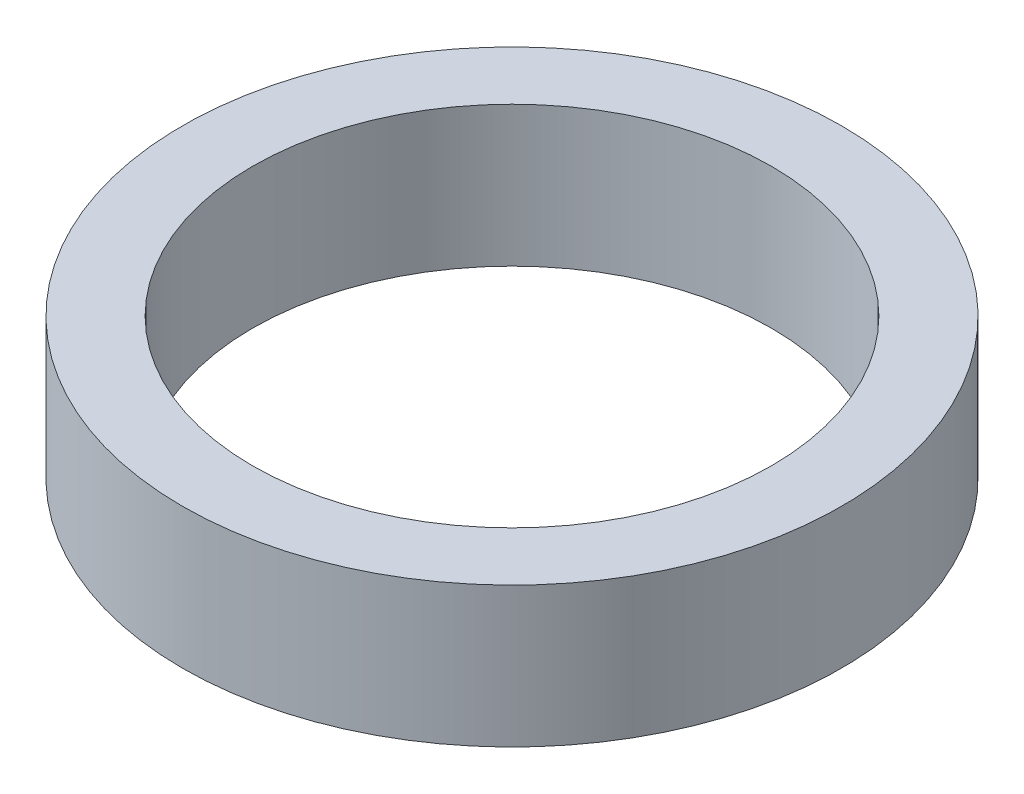
ISO-10303-21;
HEADER;
FILE_DESCRIPTION(('STEP AP214'),'2;1');
FILE_NAME('part.step','',(''),(''),'','','');
FILE_SCHEMA(('AUTOMOTIVE_DESIGN { 1 0 10303 214 1 1 1 1 }'));
ENDSEC;
DATA;
#1=APPLICATION_CONTEXT('core data for automotive mechanical design processes');
#2=APPLICATION_PROTOCOL_DEFINITION('international standard','automotive_design',2000,#1);
#3=PRODUCT_CONTEXT('',#1,'mechanical');
#4=PRODUCT('Part','Part','',(#3));
#5=PRODUCT_RELATED_PRODUCT_CATEGORY('part','',(#4));
#6=PRODUCT_DEFINITION_FORMATION('','',#4);
#7=PRODUCT_DEFINITION_CONTEXT('part definition',#1,'design');
#8=PRODUCT_DEFINITION('design','',#6,#7);
#9=PRODUCT_DEFINITION_SHAPE('','',#8);
#10=(LENGTH_UNIT() NAMED_UNIT(*) SI_UNIT(.MILLI.,.METRE.));
#11=(NAMED_UNIT(*) PLANE_ANGLE_UNIT() SI_UNIT($,.RADIAN.));
#12=(NAMED_UNIT(*) SI_UNIT($,.STERADIAN.) SOLID_ANGLE_UNIT());
#13=UNCERTAINTY_MEASURE_WITH_UNIT(LENGTH_MEASURE(1.E-05),#10,'distance_accuracy_value','');
#14=(GEOMETRIC_REPRESENTATION_CONTEXT(3) GLOBAL_UNCERTAINTY_ASSIGNED_CONTEXT((#13)) GLOBAL_UNIT_ASSIGNED_CONTEXT((#10,
#11,#12)) REPRESENTATION_CONTEXT('',''));
#15=CARTESIAN_POINT('',(0.,0.,0.));
#16=DIRECTION('',(0.,0.,1.));
#17=DIRECTION('',(1.,0.,0.));
#18=AXIS2_PLACEMENT_3D('',#15,#16,#17);
#19=CARTESIAN_POINT('',(0.,12.7,0.));
#20=DIRECTION('',(0.,-1.,0.));
#21=DIRECTION('',(0.,0.,-1.));
#22=AXIS2_PLACEMENT_3D('',#19,#20,#21);
#23=CYLINDRICAL_SURFACE('',#22,23.495);
#24=CARTESIAN_POINT('',(0.,12.7,0.));
#25=DIRECTION('',(0.,1.,0.));
#26=DIRECTION('',(0.,0.,1.));
#27=AXIS2_PLACEMENT_3D('',#24,#25,#26);
#28=CIRCLE('',#27,23.495);
#29=CARTESIAN_POINT('',(0.,12.7,23.495));
#30=VERTEX_POINT('',#29);
#31=EDGE_CURVE('E50',#30,#30,#28,.T.);
#32=ORIENTED_EDGE('',*,*,#31,.T.);
#33=EDGE_LOOP('',(#32));
#34=FACE_BOUND('',#33,.T.);
#35=CARTESIAN_POINT('',(0.,0.,0.));
#36=DIRECTION('',(0.,1.,0.));
#37=DIRECTION('',(0.,0.,1.));
#38=AXIS2_PLACEMENT_3D('',#35,#36,#37);
#39=CIRCLE('',#38,23.495);
#40=CARTESIAN_POINT('',(0.,0.,23.495));
#41=VERTEX_POINT('',#40);
#42=EDGE_CURVE('E45',#41,#41,#39,.T.);
#43=ORIENTED_EDGE('',*,*,#42,.F.);
#44=EDGE_LOOP('',(#43));
#45=FACE_BOUND('',#44,.T.);
#46=ADVANCED_FACE('F42',(#34,#45),#23,.F.);
#47=CARTESIAN_POINT('',(0.,12.7,0.));
#48=DIRECTION('',(0.,-1.,0.));
#49=DIRECTION('',(0.,0.,-1.));
#50=AXIS2_PLACEMENT_3D('',#47,#48,#49);
#51=CYLINDRICAL_SURFACE('',#50,29.845);
#52=CARTESIAN_POINT('',(0.,12.7,0.));
#53=DIRECTION('',(0.,1.,0.));
#54=DIRECTION('',(0.,0.,1.));
#55=AXIS2_PLACEMENT_3D('',#52,#53,#54);
#56=CIRCLE('',#55,29.845);
#57=CARTESIAN_POINT('',(0.,12.7,29.845));
#58=VERTEX_POINT('',#57);
#59=EDGE_CURVE('E10',#58,#58,#56,.T.);
#60=ORIENTED_EDGE('',*,*,#59,.F.);
#61=EDGE_LOOP('',(#60));
#62=FACE_BOUND('',#61,.T.);
#63=CARTESIAN_POINT('',(0.,0.,0.));
#64=DIRECTION('',(0.,-1.,0.));
#65=DIRECTION('',(0.,0.,-1.));
#66=AXIS2_PLACEMENT_3D('',#63,#64,#65);
#67=CIRCLE('',#66,29.845);
#68=CARTESIAN_POINT('',(0.,0.,-29.845));
#69=VERTEX_POINT('',#68);
#70=EDGE_CURVE('E57',#69,#69,#67,.T.);
#71=ORIENTED_EDGE('',*,*,#70,.F.);
#72=EDGE_LOOP('',(#71));
#73=FACE_BOUND('',#72,.T.);
#74=ADVANCED_FACE('F69',(#62,#73),#51,.T.);
#75=CARTESIAN_POINT('',(0.,12.7,0.));
#76=DIRECTION('',(0.,1.,0.));
#77=DIRECTION('',(0.,0.,1.));
#78=AXIS2_PLACEMENT_3D('',#75,#76,#77);
#79=PLANE('',#78);
#80=ORIENTED_EDGE('',*,*,#31,.F.);
#81=EDGE_LOOP('',(#80));
#82=FACE_BOUND('',#81,.T.);
#83=ORIENTED_EDGE('',*,*,#59,.T.);
#84=EDGE_LOOP('',(#83));
#85=FACE_BOUND('',#84,.T.);
#86=ADVANCED_FACE('F74',(#82,#85),#79,.T.);
#87=CARTESIAN_POINT('',(0.,0.,0.));
#88=DIRECTION('',(0.,-1.,0.));
#89=DIRECTION('',(0.,0.,-1.));
#90=AXIS2_PLACEMENT_3D('',#87,#88,#89);
#91=TOROIDAL_SURFACE('',#90,26.67,3.175);
#92=ORIENTED_EDGE('',*,*,#42,.T.);
#93=EDGE_LOOP('',(#92));
#94=FACE_BOUND('',#93,.T.);
#95=ORIENTED_EDGE('',*,*,#70,.T.);
#96=EDGE_LOOP('',(#95));
#97=FACE_BOUND('',#96,.T.);
#98=ADVANCED_FACE('F66',(#94,#97),#91,.F.);
#99=CLOSED_SHELL('',(#46,#74,#86,#98));
#100=MANIFOLD_SOLID_BREP('B2',#99);
#101=ADVANCED_BREP_SHAPE_REPRESENTATION('',(#18,#100),#14);
#102=SHAPE_DEFINITION_REPRESENTATION(#9,#101);
ENDSEC;
END-ISO-10303-21;
